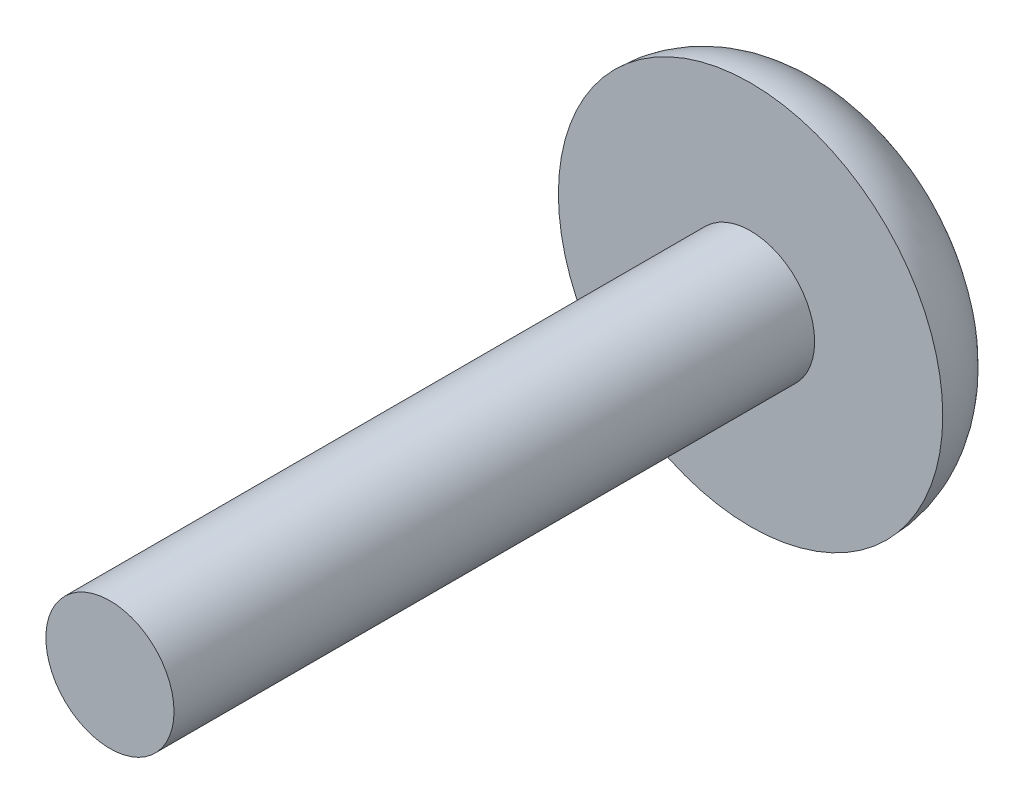
ISO-10303-21;
HEADER;
FILE_DESCRIPTION(('STEP AP214'),'2;1');
FILE_NAME('part.step','',(''),(''),'','','');
FILE_SCHEMA(('AUTOMOTIVE_DESIGN { 1 0 10303 214 1 1 1 1 }'));
ENDSEC;
DATA;
#1=APPLICATION_CONTEXT('core data for automotive mechanical design processes');
#2=APPLICATION_PROTOCOL_DEFINITION('international standard','automotive_design',2000,#1);
#3=PRODUCT_CONTEXT('',#1,'mechanical');
#4=PRODUCT('Part','Part','',(#3));
#5=PRODUCT_RELATED_PRODUCT_CATEGORY('part','',(#4));
#6=PRODUCT_DEFINITION_FORMATION('','',#4);
#7=PRODUCT_DEFINITION_CONTEXT('part definition',#1,'design');
#8=PRODUCT_DEFINITION('design','',#6,#7);
#9=PRODUCT_DEFINITION_SHAPE('','',#8);
#10=(LENGTH_UNIT() NAMED_UNIT(*) SI_UNIT(.MILLI.,.METRE.));
#11=(NAMED_UNIT(*) PLANE_ANGLE_UNIT() SI_UNIT($,.RADIAN.));
#12=(NAMED_UNIT(*) SI_UNIT($,.STERADIAN.) SOLID_ANGLE_UNIT());
#13=UNCERTAINTY_MEASURE_WITH_UNIT(LENGTH_MEASURE(1.E-05),#10,'distance_accuracy_value','');
#14=(GEOMETRIC_REPRESENTATION_CONTEXT(3) GLOBAL_UNCERTAINTY_ASSIGNED_CONTEXT((#13)) GLOBAL_UNIT_ASSIGNED_CONTEXT((#10,
#11,#12)) REPRESENTATION_CONTEXT('',''));
#15=CARTESIAN_POINT('',(0.,0.,0.));
#16=DIRECTION('',(0.,0.,1.));
#17=DIRECTION('',(1.,0.,0.));
#18=AXIS2_PLACEMENT_3D('',#15,#16,#17);
#19=CARTESIAN_POINT('',(0.,0.,2.));
#20=DIRECTION('',(0.,0.,1.));
#21=DIRECTION('',(1.,0.,0.));
#22=AXIS2_PLACEMENT_3D('',#19,#20,#21);
#23=PLANE('',#22);
#24=CARTESIAN_POINT('',(0.,0.,2.));
#25=DIRECTION('',(0.,0.,1.));
#26=DIRECTION('',(1.,0.,0.));
#27=AXIS2_PLACEMENT_3D('',#24,#25,#26);
#28=CIRCLE('',#27,1.5);
#29=CARTESIAN_POINT('',(1.5,0.,2.));
#30=VERTEX_POINT('',#29);
#31=EDGE_CURVE('E283',#30,#30,#28,.T.);
#32=ORIENTED_EDGE('',*,*,#31,.F.);
#33=EDGE_LOOP('',(#32));
#34=FACE_BOUND('',#33,.T.);
#35=CARTESIAN_POINT('',(0.,0.,2.));
#36=DIRECTION('',(0.,0.,1.));
#37=DIRECTION('',(1.,0.,0.));
#38=AXIS2_PLACEMENT_3D('',#35,#36,#37);
#39=CIRCLE('',#38,4.5);
#40=CARTESIAN_POINT('',(4.5,0.,2.));
#41=VERTEX_POINT('',#40);
#42=EDGE_CURVE('E44',#41,#41,#39,.T.);
#43=ORIENTED_EDGE('',*,*,#42,.T.);
#44=EDGE_LOOP('',(#43));
#45=FACE_BOUND('',#44,.T.);
#46=ADVANCED_FACE('F36',(#34,#45),#23,.T.);
#47=CARTESIAN_POINT('',(0.,0.,0.));
#48=DIRECTION('',(0.,0.,1.));
#49=DIRECTION('',(1.,0.,0.));
#50=AXIS2_PLACEMENT_3D('',#47,#48,#49);
#51=PLANE('',#50);
#52=DIRECTION('',(-1.,0.,0.));
#53=VECTOR('',#52,1.);
#54=CARTESIAN_POINT('',(-0.230798636328818,-1.45,0.));
#55=LINE('',#54,#53);
#56=CARTESIAN_POINT('',(0.269201363671182,-1.45,0.));
#57=VERTEX_POINT('',#56);
#58=CARTESIAN_POINT('',(-0.230798636328818,-1.45,0.));
#59=VERTEX_POINT('',#58);
#60=EDGE_CURVE('E161',#57,#59,#55,.T.);
#61=ORIENTED_EDGE('',*,*,#60,.F.);
#62=DIRECTION('',(0.0319858978707063,-0.999488320260625,0.));
#63=VECTOR('',#62,1.);
#64=CARTESIAN_POINT('',(0.230798636328817,-0.25,0.));
#65=LINE('',#64,#63);
#66=CARTESIAN_POINT('',(0.230798636328817,-0.25,0.));
#67=VERTEX_POINT('',#66);
#68=EDGE_CURVE('E51',#67,#57,#65,.T.);
#69=ORIENTED_EDGE('',*,*,#68,.F.);
#70=DIRECTION('',(-1.,0.,0.));
#71=VECTOR('',#70,1.);
#72=CARTESIAN_POINT('',(1.43079863632882,-0.25,0.));
#73=LINE('',#72,#71);
#74=CARTESIAN_POINT('',(1.43079863632882,-0.25,0.));
#75=VERTEX_POINT('',#74);
#76=EDGE_CURVE('E189',#75,#67,#73,.T.);
#77=ORIENTED_EDGE('',*,*,#76,.F.);
#78=DIRECTION('',(0.,-1.,0.));
#79=VECTOR('',#78,1.);
#80=CARTESIAN_POINT('',(1.43079863632882,-0.25,0.));
#81=LINE('',#80,#79);
#82=CARTESIAN_POINT('',(1.43079863632882,0.25,0.));
#83=VERTEX_POINT('',#82);
#84=EDGE_CURVE('E187',#83,#75,#81,.T.);
#85=ORIENTED_EDGE('',*,*,#84,.F.);
#86=DIRECTION('',(1.,0.,0.));
#87=VECTOR('',#86,1.);
#88=CARTESIAN_POINT('',(1.43079863632882,0.25,0.));
#89=LINE('',#88,#87);
#90=CARTESIAN_POINT('',(0.230798636328817,0.25,0.));
#91=VERTEX_POINT('',#90);
#92=EDGE_CURVE('E135',#91,#83,#89,.T.);
#93=ORIENTED_EDGE('',*,*,#92,.F.);
#94=DIRECTION('',(0.,-1.,0.));
#95=VECTOR('',#94,1.);
#96=CARTESIAN_POINT('',(0.230798636328817,1.45,0.));
#97=LINE('',#96,#95);
#98=CARTESIAN_POINT('',(0.230798636328817,1.45,0.));
#99=VERTEX_POINT('',#98);
#100=EDGE_CURVE('E183',#99,#91,#97,.T.);
#101=ORIENTED_EDGE('',*,*,#100,.F.);
#102=DIRECTION('',(1.,0.,0.));
#103=VECTOR('',#102,1.);
#104=CARTESIAN_POINT('',(-0.230798636328818,1.45,0.));
#105=LINE('',#104,#103);
#106=CARTESIAN_POINT('',(-0.230798636328818,1.45,0.));
#107=VERTEX_POINT('',#106);
#108=EDGE_CURVE('E180',#107,#99,#105,.T.);
#109=ORIENTED_EDGE('',*,*,#108,.F.);
#110=DIRECTION('',(0.,1.,0.));
#111=VECTOR('',#110,1.);
#112=CARTESIAN_POINT('',(-0.230798636328818,1.45,0.));
#113=LINE('',#112,#111);
#114=CARTESIAN_POINT('',(-0.230798636328818,0.25,0.));
#115=VERTEX_POINT('',#114);
#116=EDGE_CURVE('E177',#115,#107,#113,.T.);
#117=ORIENTED_EDGE('',*,*,#116,.F.);
#118=DIRECTION('',(1.,0.,0.));
#119=VECTOR('',#118,1.);
#120=CARTESIAN_POINT('',(-0.230798636328818,0.25,0.));
#121=LINE('',#120,#119);
#122=CARTESIAN_POINT('',(-1.43079863632882,0.25,0.));
#123=VERTEX_POINT('',#122);
#124=EDGE_CURVE('E174',#123,#115,#121,.T.);
#125=ORIENTED_EDGE('',*,*,#124,.F.);
#126=DIRECTION('',(0.,1.,0.));
#127=VECTOR('',#126,1.);
#128=CARTESIAN_POINT('',(-1.43079863632882,-0.25,0.));
#129=LINE('',#128,#127);
#130=CARTESIAN_POINT('',(-1.43079863632882,-0.25,0.));
#131=VERTEX_POINT('',#130);
#132=EDGE_CURVE('E171',#131,#123,#129,.T.);
#133=ORIENTED_EDGE('',*,*,#132,.F.);
#134=DIRECTION('',(-1.,0.,0.));
#135=VECTOR('',#134,1.);
#136=CARTESIAN_POINT('',(-0.230798636328818,-0.25,0.));
#137=LINE('',#136,#135);
#138=CARTESIAN_POINT('',(-0.230798636328818,-0.25,0.));
#139=VERTEX_POINT('',#138);
#140=EDGE_CURVE('E168',#139,#131,#137,.T.);
#141=ORIENTED_EDGE('',*,*,#140,.F.);
#142=DIRECTION('',(0.,1.,0.));
#143=VECTOR('',#142,1.);
#144=CARTESIAN_POINT('',(-0.230798636328818,-0.25,0.));
#145=LINE('',#144,#143);
#146=EDGE_CURVE('E165',#59,#139,#145,.T.);
#147=ORIENTED_EDGE('',*,*,#146,.F.);
#148=EDGE_LOOP('',(#61,#69,#77,#85,#93,#101,#109,#117,#125,#133,#141,#147));
#149=FACE_BOUND('',#148,.T.);
#150=CARTESIAN_POINT('',(0.,0.,0.));
#151=DIRECTION('',(0.,0.,1.));
#152=DIRECTION('',(1.,0.,0.));
#153=AXIS2_PLACEMENT_3D('',#150,#151,#152);
#154=CIRCLE('',#153,2.5);
#155=CARTESIAN_POINT('',(2.5,0.,0.));
#156=VERTEX_POINT('',#155);
#157=EDGE_CURVE('E11',#156,#156,#154,.F.);
#158=ORIENTED_EDGE('',*,*,#157,.T.);
#159=EDGE_LOOP('',(#158));
#160=FACE_BOUND('',#159,.T.);
#161=ADVANCED_FACE('F215',(#149,#160),#51,.F.);
#162=CARTESIAN_POINT('',(0.,0.,2.));
#163=DIRECTION('',(0.,0.,1.));
#164=DIRECTION('',(1.,0.,0.));
#165=AXIS2_PLACEMENT_3D('',#162,#163,#164);
#166=TOROIDAL_SURFACE('',#165,2.5,2.);
#167=ORIENTED_EDGE('',*,*,#157,.F.);
#168=EDGE_LOOP('',(#167));
#169=FACE_BOUND('',#168,.T.);
#170=ORIENTED_EDGE('',*,*,#42,.F.);
#171=EDGE_LOOP('',(#170));
#172=FACE_BOUND('',#171,.T.);
#173=ADVANCED_FACE('F38',(#169,#172),#166,.T.);
#174=CARTESIAN_POINT('',(0.230798636328817,-0.25,0.5));
#175=DIRECTION('',(0.999488320260625,0.0319858978707063,0.));
#176=DIRECTION('',(-0.0319858978707063,0.999488320260625,0.));
#177=AXIS2_PLACEMENT_3D('',#174,#175,#176);
#178=PLANE('',#177);
#179=ORIENTED_EDGE('',*,*,#68,.T.);
#180=DIRECTION('',(0.,0.,-1.));
#181=VECTOR('',#180,1.);
#182=CARTESIAN_POINT('',(0.269201363671182,-1.45,0.5));
#183=LINE('',#182,#181);
#184=CARTESIAN_POINT('',(0.269201363671182,-1.45,0.5));
#185=VERTEX_POINT('',#184);
#186=EDGE_CURVE('E99',#185,#57,#183,.T.);
#187=ORIENTED_EDGE('',*,*,#186,.F.);
#188=DIRECTION('',(0.0319858978707063,-0.999488320260625,0.));
#189=VECTOR('',#188,1.);
#190=CARTESIAN_POINT('',(0.230798636328817,-0.25,0.5));
#191=LINE('',#190,#189);
#192=CARTESIAN_POINT('',(0.230798636328817,-0.25,0.5));
#193=VERTEX_POINT('',#192);
#194=EDGE_CURVE('E191',#193,#185,#191,.T.);
#195=ORIENTED_EDGE('',*,*,#194,.F.);
#196=DIRECTION('',(0.,0.,-1.));
#197=VECTOR('',#196,1.);
#198=CARTESIAN_POINT('',(0.230798636328817,-0.25,0.5));
#199=LINE('',#198,#197);
#200=EDGE_CURVE('E59',#193,#67,#199,.T.);
#201=ORIENTED_EDGE('',*,*,#200,.T.);
#202=EDGE_LOOP('',(#179,#187,#195,#201));
#203=FACE_BOUND('',#202,.T.);
#204=ADVANCED_FACE('F214',(#203),#178,.F.);
#205=CARTESIAN_POINT('',(1.43079863632882,-0.25,0.5));
#206=DIRECTION('',(0.,-1.,0.));
#207=DIRECTION('',(0.,0.,-1.));
#208=AXIS2_PLACEMENT_3D('',#205,#206,#207);
#209=PLANE('',#208);
#210=ORIENTED_EDGE('',*,*,#76,.T.);
#211=ORIENTED_EDGE('',*,*,#200,.F.);
#212=DIRECTION('',(-1.,0.,0.));
#213=VECTOR('',#212,1.);
#214=CARTESIAN_POINT('',(1.43079863632882,-0.25,0.5));
#215=LINE('',#214,#213);
#216=CARTESIAN_POINT('',(1.43079863632882,-0.25,0.5));
#217=VERTEX_POINT('',#216);
#218=EDGE_CURVE('E147',#217,#193,#215,.T.);
#219=ORIENTED_EDGE('',*,*,#218,.F.);
#220=DIRECTION('',(0.,0.,-1.));
#221=VECTOR('',#220,1.);
#222=CARTESIAN_POINT('',(1.43079863632882,-0.25,0.5));
#223=LINE('',#222,#221);
#224=EDGE_CURVE('E139',#217,#75,#223,.T.);
#225=ORIENTED_EDGE('',*,*,#224,.T.);
#226=EDGE_LOOP('',(#210,#211,#219,#225));
#227=FACE_BOUND('',#226,.T.);
#228=ADVANCED_FACE('F221',(#227),#209,.F.);
#229=CARTESIAN_POINT('',(1.43079863632882,-0.25,0.5));
#230=DIRECTION('',(1.,0.,0.));
#231=DIRECTION('',(0.,0.,-1.));
#232=AXIS2_PLACEMENT_3D('',#229,#230,#231);
#233=PLANE('',#232);
#234=ORIENTED_EDGE('',*,*,#84,.T.);
#235=ORIENTED_EDGE('',*,*,#224,.F.);
#236=DIRECTION('',(0.,-1.,0.));
#237=VECTOR('',#236,1.);
#238=CARTESIAN_POINT('',(1.43079863632882,-0.25,0.5));
#239=LINE('',#238,#237);
#240=CARTESIAN_POINT('',(1.43079863632882,0.25,0.5));
#241=VERTEX_POINT('',#240);
#242=EDGE_CURVE('E143',#241,#217,#239,.T.);
#243=ORIENTED_EDGE('',*,*,#242,.F.);
#244=DIRECTION('',(0.,0.,-1.));
#245=VECTOR('',#244,1.);
#246=CARTESIAN_POINT('',(1.43079863632882,0.25,0.5));
#247=LINE('',#246,#245);
#248=EDGE_CURVE('E128',#241,#83,#247,.T.);
#249=ORIENTED_EDGE('',*,*,#248,.T.);
#250=EDGE_LOOP('',(#234,#235,#243,#249));
#251=FACE_BOUND('',#250,.T.);
#252=ADVANCED_FACE('F144',(#251),#233,.F.);
#253=CARTESIAN_POINT('',(1.43079863632882,0.25,0.5));
#254=DIRECTION('',(0.,1.,0.));
#255=DIRECTION('',(-1.,0.,0.));
#256=AXIS2_PLACEMENT_3D('',#253,#254,#255);
#257=PLANE('',#256);
#258=ORIENTED_EDGE('',*,*,#92,.T.);
#259=ORIENTED_EDGE('',*,*,#248,.F.);
#260=DIRECTION('',(1.,0.,0.));
#261=VECTOR('',#260,1.);
#262=CARTESIAN_POINT('',(1.43079863632882,0.25,0.5));
#263=LINE('',#262,#261);
#264=CARTESIAN_POINT('',(0.230798636328817,0.25,0.5));
#265=VERTEX_POINT('',#264);
#266=EDGE_CURVE('E132',#265,#241,#263,.T.);
#267=ORIENTED_EDGE('',*,*,#266,.F.);
#268=DIRECTION('',(0.,0.,-1.));
#269=VECTOR('',#268,1.);
#270=CARTESIAN_POINT('',(0.230798636328817,0.25,0.5));
#271=LINE('',#270,#269);
#272=EDGE_CURVE('E140',#265,#91,#271,.T.);
#273=ORIENTED_EDGE('',*,*,#272,.T.);
#274=EDGE_LOOP('',(#258,#259,#267,#273));
#275=FACE_BOUND('',#274,.T.);
#276=ADVANCED_FACE('F130',(#275),#257,.F.);
#277=CARTESIAN_POINT('',(0.230798636328817,1.45,0.5));
#278=DIRECTION('',(1.,0.,0.));
#279=DIRECTION('',(0.,1.,0.));
#280=AXIS2_PLACEMENT_3D('',#277,#278,#279);
#281=PLANE('',#280);
#282=ORIENTED_EDGE('',*,*,#100,.T.);
#283=ORIENTED_EDGE('',*,*,#272,.F.);
#284=DIRECTION('',(0.,-1.,0.));
#285=VECTOR('',#284,1.);
#286=CARTESIAN_POINT('',(0.230798636328817,1.45,0.5));
#287=LINE('',#286,#285);
#288=CARTESIAN_POINT('',(0.230798636328817,1.45,0.5));
#289=VERTEX_POINT('',#288);
#290=EDGE_CURVE('E153',#289,#265,#287,.T.);
#291=ORIENTED_EDGE('',*,*,#290,.F.);
#292=DIRECTION('',(0.,0.,-1.));
#293=VECTOR('',#292,1.);
#294=CARTESIAN_POINT('',(0.230798636328817,1.45,0.5));
#295=LINE('',#294,#293);
#296=EDGE_CURVE('E195',#289,#99,#295,.T.);
#297=ORIENTED_EDGE('',*,*,#296,.T.);
#298=EDGE_LOOP('',(#282,#283,#291,#297));
#299=FACE_BOUND('',#298,.T.);
#300=ADVANCED_FACE('F259',(#299),#281,.F.);
#301=CARTESIAN_POINT('',(-0.230798636328818,1.45,0.5));
#302=DIRECTION('',(0.,1.,0.));
#303=DIRECTION('',(0.,0.,1.));
#304=AXIS2_PLACEMENT_3D('',#301,#302,#303);
#305=PLANE('',#304);
#306=ORIENTED_EDGE('',*,*,#108,.T.);
#307=ORIENTED_EDGE('',*,*,#296,.F.);
#308=DIRECTION('',(1.,0.,0.));
#309=VECTOR('',#308,1.);
#310=CARTESIAN_POINT('',(-0.230798636328818,1.45,0.5));
#311=LINE('',#310,#309);
#312=CARTESIAN_POINT('',(-0.230798636328818,1.45,0.5));
#313=VERTEX_POINT('',#312);
#314=EDGE_CURVE('E155',#313,#289,#311,.T.);
#315=ORIENTED_EDGE('',*,*,#314,.F.);
#316=DIRECTION('',(0.,0.,-1.));
#317=VECTOR('',#316,1.);
#318=CARTESIAN_POINT('',(-0.230798636328818,1.45,0.5));
#319=LINE('',#318,#317);
#320=EDGE_CURVE('E197',#313,#107,#319,.T.);
#321=ORIENTED_EDGE('',*,*,#320,.T.);
#322=EDGE_LOOP('',(#306,#307,#315,#321));
#323=FACE_BOUND('',#322,.T.);
#324=ADVANCED_FACE('F255',(#323),#305,.F.);
#325=CARTESIAN_POINT('',(-0.230798636328818,1.45,0.5));
#326=DIRECTION('',(-1.,0.,0.));
#327=DIRECTION('',(0.,-1.,0.));
#328=AXIS2_PLACEMENT_3D('',#325,#326,#327);
#329=PLANE('',#328);
#330=ORIENTED_EDGE('',*,*,#116,.T.);
#331=ORIENTED_EDGE('',*,*,#320,.F.);
#332=DIRECTION('',(0.,1.,0.));
#333=VECTOR('',#332,1.);
#334=CARTESIAN_POINT('',(-0.230798636328818,1.45,0.5));
#335=LINE('',#334,#333);
#336=CARTESIAN_POINT('',(-0.230798636328818,0.25,0.5));
#337=VERTEX_POINT('',#336);
#338=EDGE_CURVE('E304',#337,#313,#335,.T.);
#339=ORIENTED_EDGE('',*,*,#338,.F.);
#340=DIRECTION('',(0.,0.,-1.));
#341=VECTOR('',#340,1.);
#342=CARTESIAN_POINT('',(-0.230798636328818,0.25,0.5));
#343=LINE('',#342,#341);
#344=EDGE_CURVE('E199',#337,#115,#343,.T.);
#345=ORIENTED_EDGE('',*,*,#344,.T.);
#346=EDGE_LOOP('',(#330,#331,#339,#345));
#347=FACE_BOUND('',#346,.T.);
#348=ADVANCED_FACE('F251',(#347),#329,.F.);
#349=CARTESIAN_POINT('',(-0.230798636328818,0.25,0.5));
#350=DIRECTION('',(0.,1.,0.));
#351=DIRECTION('',(0.,0.,1.));
#352=AXIS2_PLACEMENT_3D('',#349,#350,#351);
#353=PLANE('',#352);
#354=ORIENTED_EDGE('',*,*,#124,.T.);
#355=ORIENTED_EDGE('',*,*,#344,.F.);
#356=DIRECTION('',(1.,0.,0.));
#357=VECTOR('',#356,1.);
#358=CARTESIAN_POINT('',(-0.230798636328818,0.25,0.5));
#359=LINE('',#358,#357);
#360=CARTESIAN_POINT('',(-1.43079863632882,0.25,0.5));
#361=VERTEX_POINT('',#360);
#362=EDGE_CURVE('E301',#361,#337,#359,.T.);
#363=ORIENTED_EDGE('',*,*,#362,.F.);
#364=DIRECTION('',(0.,0.,-1.));
#365=VECTOR('',#364,1.);
#366=CARTESIAN_POINT('',(-1.43079863632882,0.25,0.5));
#367=LINE('',#366,#365);
#368=EDGE_CURVE('E201',#361,#123,#367,.T.);
#369=ORIENTED_EDGE('',*,*,#368,.T.);
#370=EDGE_LOOP('',(#354,#355,#363,#369));
#371=FACE_BOUND('',#370,.T.);
#372=ADVANCED_FACE('F247',(#371),#353,.F.);
#373=CARTESIAN_POINT('',(-1.43079863632882,-0.25,0.5));
#374=DIRECTION('',(-1.,0.,0.));
#375=DIRECTION('',(0.,0.,1.));
#376=AXIS2_PLACEMENT_3D('',#373,#374,#375);
#377=PLANE('',#376);
#378=ORIENTED_EDGE('',*,*,#132,.T.);
#379=ORIENTED_EDGE('',*,*,#368,.F.);
#380=DIRECTION('',(0.,1.,0.));
#381=VECTOR('',#380,1.);
#382=CARTESIAN_POINT('',(-1.43079863632882,-0.25,0.5));
#383=LINE('',#382,#381);
#384=CARTESIAN_POINT('',(-1.43079863632882,-0.25,0.5));
#385=VERTEX_POINT('',#384);
#386=EDGE_CURVE('E298',#385,#361,#383,.T.);
#387=ORIENTED_EDGE('',*,*,#386,.F.);
#388=DIRECTION('',(0.,0.,-1.));
#389=VECTOR('',#388,1.);
#390=CARTESIAN_POINT('',(-1.43079863632882,-0.25,0.5));
#391=LINE('',#390,#389);
#392=EDGE_CURVE('E203',#385,#131,#391,.T.);
#393=ORIENTED_EDGE('',*,*,#392,.T.);
#394=EDGE_LOOP('',(#378,#379,#387,#393));
#395=FACE_BOUND('',#394,.T.);
#396=ADVANCED_FACE('F243',(#395),#377,.F.);
#397=CARTESIAN_POINT('',(-0.230798636328818,-0.25,0.5));
#398=DIRECTION('',(0.,-1.,0.));
#399=DIRECTION('',(0.,0.,-1.));
#400=AXIS2_PLACEMENT_3D('',#397,#398,#399);
#401=PLANE('',#400);
#402=ORIENTED_EDGE('',*,*,#140,.T.);
#403=ORIENTED_EDGE('',*,*,#392,.F.);
#404=DIRECTION('',(-1.,0.,0.));
#405=VECTOR('',#404,1.);
#406=CARTESIAN_POINT('',(-0.230798636328818,-0.25,0.5));
#407=LINE('',#406,#405);
#408=CARTESIAN_POINT('',(-0.230798636328818,-0.25,0.5));
#409=VERTEX_POINT('',#408);
#410=EDGE_CURVE('E295',#409,#385,#407,.T.);
#411=ORIENTED_EDGE('',*,*,#410,.F.);
#412=DIRECTION('',(0.,0.,-1.));
#413=VECTOR('',#412,1.);
#414=CARTESIAN_POINT('',(-0.230798636328818,-0.25,0.5));
#415=LINE('',#414,#413);
#416=EDGE_CURVE('E205',#409,#139,#415,.T.);
#417=ORIENTED_EDGE('',*,*,#416,.T.);
#418=EDGE_LOOP('',(#402,#403,#411,#417));
#419=FACE_BOUND('',#418,.T.);
#420=ADVANCED_FACE('F239',(#419),#401,.F.);
#421=CARTESIAN_POINT('',(-0.230798636328818,-0.25,0.5));
#422=DIRECTION('',(-1.,0.,0.));
#423=DIRECTION('',(0.,-1.,0.));
#424=AXIS2_PLACEMENT_3D('',#421,#422,#423);
#425=PLANE('',#424);
#426=ORIENTED_EDGE('',*,*,#146,.T.);
#427=ORIENTED_EDGE('',*,*,#416,.F.);
#428=DIRECTION('',(0.,1.,0.));
#429=VECTOR('',#428,1.);
#430=CARTESIAN_POINT('',(-0.230798636328818,-0.25,0.5));
#431=LINE('',#430,#429);
#432=CARTESIAN_POINT('',(-0.230798636328818,-1.45,0.5));
#433=VERTEX_POINT('',#432);
#434=EDGE_CURVE('E292',#433,#409,#431,.T.);
#435=ORIENTED_EDGE('',*,*,#434,.F.);
#436=DIRECTION('',(0.,0.,-1.));
#437=VECTOR('',#436,1.);
#438=CARTESIAN_POINT('',(-0.230798636328818,-1.45,0.5));
#439=LINE('',#438,#437);
#440=EDGE_CURVE('E207',#433,#59,#439,.T.);
#441=ORIENTED_EDGE('',*,*,#440,.T.);
#442=EDGE_LOOP('',(#426,#427,#435,#441));
#443=FACE_BOUND('',#442,.T.);
#444=ADVANCED_FACE('F235',(#443),#425,.F.);
#445=CARTESIAN_POINT('',(-0.230798636328818,-1.45,0.5));
#446=DIRECTION('',(0.,-1.,0.));
#447=DIRECTION('',(0.,0.,-1.));
#448=AXIS2_PLACEMENT_3D('',#445,#446,#447);
#449=PLANE('',#448);
#450=ORIENTED_EDGE('',*,*,#60,.T.);
#451=ORIENTED_EDGE('',*,*,#440,.F.);
#452=DIRECTION('',(-1.,0.,0.));
#453=VECTOR('',#452,1.);
#454=CARTESIAN_POINT('',(-0.230798636328818,-1.45,0.5));
#455=LINE('',#454,#453);
#456=EDGE_CURVE('E289',#185,#433,#455,.T.);
#457=ORIENTED_EDGE('',*,*,#456,.F.);
#458=ORIENTED_EDGE('',*,*,#186,.T.);
#459=EDGE_LOOP('',(#450,#451,#457,#458));
#460=FACE_BOUND('',#459,.T.);
#461=ADVANCED_FACE('F232',(#460),#449,.F.);
#462=CARTESIAN_POINT('',(0.,0.,0.5));
#463=DIRECTION('',(0.,0.,1.));
#464=DIRECTION('',(1.,0.,0.));
#465=AXIS2_PLACEMENT_3D('',#462,#463,#464);
#466=PLANE('',#465);
#467=ORIENTED_EDGE('',*,*,#194,.T.);
#468=ORIENTED_EDGE('',*,*,#456,.T.);
#469=ORIENTED_EDGE('',*,*,#434,.T.);
#470=ORIENTED_EDGE('',*,*,#410,.T.);
#471=ORIENTED_EDGE('',*,*,#386,.T.);
#472=ORIENTED_EDGE('',*,*,#362,.T.);
#473=ORIENTED_EDGE('',*,*,#338,.T.);
#474=ORIENTED_EDGE('',*,*,#314,.T.);
#475=ORIENTED_EDGE('',*,*,#290,.T.);
#476=ORIENTED_EDGE('',*,*,#266,.T.);
#477=ORIENTED_EDGE('',*,*,#242,.T.);
#478=ORIENTED_EDGE('',*,*,#218,.T.);
#479=EDGE_LOOP('',(#467,#468,#469,#470,#471,#472,#473,#474,#475,#476,#477,#478));
#480=FACE_BOUND('',#479,.T.);
#481=ADVANCED_FACE('F150',(#480),#466,.F.);
#482=CARTESIAN_POINT('',(0.,0.,17.));
#483=DIRECTION('',(0.,0.,-1.));
#484=DIRECTION('',(-1.,0.,0.));
#485=AXIS2_PLACEMENT_3D('',#482,#483,#484);
#486=CYLINDRICAL_SURFACE('',#485,1.5);
#487=CARTESIAN_POINT('',(0.,0.,17.));
#488=DIRECTION('',(0.,0.,1.));
#489=DIRECTION('',(1.,0.,0.));
#490=AXIS2_PLACEMENT_3D('',#487,#488,#489);
#491=CIRCLE('',#490,1.5);
#492=CARTESIAN_POINT('',(1.5,0.,17.));
#493=VERTEX_POINT('',#492);
#494=EDGE_CURVE('E162',#493,#493,#491,.T.);
#495=ORIENTED_EDGE('',*,*,#494,.F.);
#496=EDGE_LOOP('',(#495));
#497=FACE_BOUND('',#496,.T.);
#498=ORIENTED_EDGE('',*,*,#31,.T.);
#499=EDGE_LOOP('',(#498));
#500=FACE_BOUND('',#499,.T.);
#501=ADVANCED_FACE('F272',(#497,#500),#486,.T.);
#502=CARTESIAN_POINT('',(0.,0.,17.));
#503=DIRECTION('',(0.,0.,1.));
#504=DIRECTION('',(1.,0.,0.));
#505=AXIS2_PLACEMENT_3D('',#502,#503,#504);
#506=PLANE('',#505);
#507=ORIENTED_EDGE('',*,*,#494,.T.);
#508=EDGE_LOOP('',(#507));
#509=FACE_BOUND('',#508,.T.);
#510=ADVANCED_FACE('F275',(#509),#506,.T.);
#511=CLOSED_SHELL('',(#46,#161,#173,#204,#228,#252,#276,#300,#324,#348,#372,#396,#420,#444,#461,
#481,#501,#510));
#512=MANIFOLD_SOLID_BREP('B2',#511);
#513=ADVANCED_BREP_SHAPE_REPRESENTATION('',(#18,#512),#14);
#514=SHAPE_DEFINITION_REPRESENTATION(#9,#513);
ENDSEC;
END-ISO-10303-21;
